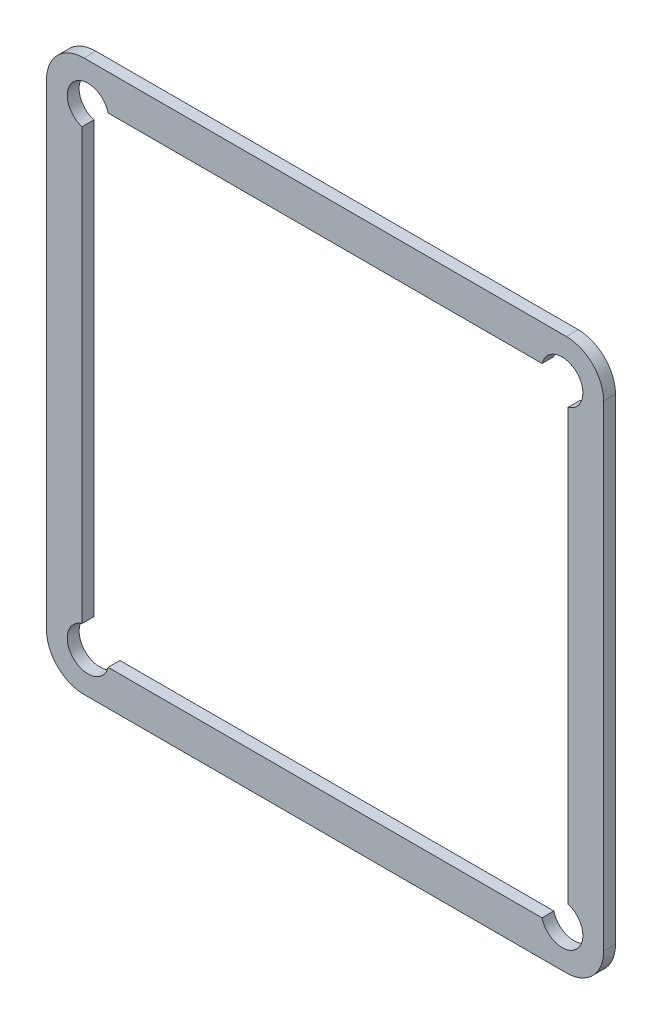
ISO-10303-21;
HEADER;
FILE_DESCRIPTION(('STEP AP214'),'2;1');
FILE_NAME('part.step','',(''),(''),'','','');
FILE_SCHEMA(('AUTOMOTIVE_DESIGN { 1 0 10303 214 1 1 1 1 }'));
ENDSEC;
DATA;
#1=APPLICATION_CONTEXT('core data for automotive mechanical design processes');
#2=APPLICATION_PROTOCOL_DEFINITION('international standard','automotive_design',2000,#1);
#3=PRODUCT_CONTEXT('',#1,'mechanical');
#4=PRODUCT('Part','Part','',(#3));
#5=PRODUCT_RELATED_PRODUCT_CATEGORY('part','',(#4));
#6=PRODUCT_DEFINITION_FORMATION('','',#4);
#7=PRODUCT_DEFINITION_CONTEXT('part definition',#1,'design');
#8=PRODUCT_DEFINITION('design','',#6,#7);
#9=PRODUCT_DEFINITION_SHAPE('','',#8);
#10=(LENGTH_UNIT() NAMED_UNIT(*) SI_UNIT(.MILLI.,.METRE.));
#11=(NAMED_UNIT(*) PLANE_ANGLE_UNIT() SI_UNIT($,.RADIAN.));
#12=(NAMED_UNIT(*) SI_UNIT($,.STERADIAN.) SOLID_ANGLE_UNIT());
#13=UNCERTAINTY_MEASURE_WITH_UNIT(LENGTH_MEASURE(1.E-05),#10,'distance_accuracy_value','');
#14=(GEOMETRIC_REPRESENTATION_CONTEXT(3) GLOBAL_UNCERTAINTY_ASSIGNED_CONTEXT((#13)) GLOBAL_UNIT_ASSIGNED_CONTEXT((#10,
#11,#12)) REPRESENTATION_CONTEXT('',''));
#15=CARTESIAN_POINT('',(0.,0.,0.));
#16=DIRECTION('',(0.,0.,1.));
#17=DIRECTION('',(1.,0.,0.));
#18=AXIS2_PLACEMENT_3D('',#15,#16,#17);
#19=CARTESIAN_POINT('',(94.,-93.,1.99999999999999));
#20=DIRECTION('',(0.,0.,-1.));
#21=DIRECTION('',(-1.,0.,0.));
#22=AXIS2_PLACEMENT_3D('',#19,#20,#21);
#23=PLANE('',#22);
#24=DIRECTION('',(-1.,0.,0.));
#25=VECTOR('',#24,1.);
#26=CARTESIAN_POINT('',(0.,0.,2.));
#27=LINE('',#26,#25);
#28=CARTESIAN_POINT('',(87.7,0.,2.));
#29=VERTEX_POINT('',#28);
#30=CARTESIAN_POINT('',(6.3,0.,2.));
#31=VERTEX_POINT('',#30);
#32=EDGE_CURVE('E222',#29,#31,#27,.T.);
#33=ORIENTED_EDGE('',*,*,#32,.T.);
#34=CARTESIAN_POINT('',(6.3,-6.29999999999997,1.99999999999997));
#35=DIRECTION('',(0.,0.,-1.));
#36=DIRECTION('',(-1.,0.,0.));
#37=AXIS2_PLACEMENT_3D('',#34,#35,#36);
#38=CIRCLE('',#37,6.3);
#39=CARTESIAN_POINT('',(0.,-6.29999999999997,1.99999999999997));
#40=VERTEX_POINT('',#39);
#41=EDGE_CURVE('E260',#31,#40,#38,.F.);
#42=ORIENTED_EDGE('',*,*,#41,.T.);
#43=DIRECTION('',(0.,-1.,0.));
#44=VECTOR('',#43,1.);
#45=CARTESIAN_POINT('',(0.,0.,2.));
#46=LINE('',#45,#44);
#47=CARTESIAN_POINT('',(0.,-86.7,1.99999999999999));
#48=VERTEX_POINT('',#47);
#49=EDGE_CURVE('E225',#40,#48,#46,.T.);
#50=ORIENTED_EDGE('',*,*,#49,.T.);
#51=CARTESIAN_POINT('',(6.3,-86.7,1.99999999999999));
#52=DIRECTION('',(0.,0.,-1.));
#53=DIRECTION('',(-1.,0.,0.));
#54=AXIS2_PLACEMENT_3D('',#51,#52,#53);
#55=CIRCLE('',#54,6.3);
#56=CARTESIAN_POINT('',(6.3,-93.,1.99999999999999));
#57=VERTEX_POINT('',#56);
#58=EDGE_CURVE('E255',#48,#57,#55,.F.);
#59=ORIENTED_EDGE('',*,*,#58,.T.);
#60=DIRECTION('',(1.,0.,0.));
#61=VECTOR('',#60,1.);
#62=CARTESIAN_POINT('',(0.,-93.,1.99999999999999));
#63=LINE('',#62,#61);
#64=CARTESIAN_POINT('',(87.7,-93.,1.99999999999999));
#65=VERTEX_POINT('',#64);
#66=EDGE_CURVE('E217',#57,#65,#63,.T.);
#67=ORIENTED_EDGE('',*,*,#66,.T.);
#68=CARTESIAN_POINT('',(87.7,-86.7,1.99999999999999));
#69=DIRECTION('',(0.,0.,-1.));
#70=DIRECTION('',(-1.,0.,0.));
#71=AXIS2_PLACEMENT_3D('',#68,#69,#70);
#72=CIRCLE('',#71,6.3);
#73=CARTESIAN_POINT('',(94.,-86.7,1.99999999999999));
#74=VERTEX_POINT('',#73);
#75=EDGE_CURVE('E54',#65,#74,#72,.F.);
#76=ORIENTED_EDGE('',*,*,#75,.T.);
#77=DIRECTION('',(0.,1.,0.));
#78=VECTOR('',#77,1.);
#79=CARTESIAN_POINT('',(94.,0.,2.));
#80=LINE('',#79,#78);
#81=CARTESIAN_POINT('',(94.,-6.29999999999997,1.99999999999997));
#82=VERTEX_POINT('',#81);
#83=EDGE_CURVE('E219',#74,#82,#80,.T.);
#84=ORIENTED_EDGE('',*,*,#83,.T.);
#85=CARTESIAN_POINT('',(87.7,-6.29999999999997,1.99999999999997));
#86=DIRECTION('',(0.,0.,-1.));
#87=DIRECTION('',(-1.,0.,0.));
#88=AXIS2_PLACEMENT_3D('',#85,#86,#87);
#89=CIRCLE('',#88,6.3);
#90=EDGE_CURVE('E258',#82,#29,#89,.F.);
#91=ORIENTED_EDGE('',*,*,#90,.T.);
#92=EDGE_LOOP('',(#33,#42,#50,#59,#67,#76,#84,#91));
#93=FACE_BOUND('',#92,.T.);
#94=CARTESIAN_POINT('',(87.,-86.1499999999999,2.));
#95=DIRECTION('',(0.,0.,1.));
#96=DIRECTION('',(-1.,0.,0.));
#97=AXIS2_PLACEMENT_3D('',#94,#95,#96);
#98=CIRCLE('',#97,3.49999999999998);
#99=CARTESIAN_POINT('',(83.604782775727,-87.,2.00000000000002));
#100=VERTEX_POINT('',#99);
#101=CARTESIAN_POINT('',(88.,-82.7958980337503,2.00000000000002));
#102=VERTEX_POINT('',#101);
#103=EDGE_CURVE('E147',#100,#102,#98,.T.);
#104=ORIENTED_EDGE('',*,*,#103,.F.);
#105=DIRECTION('',(1.,0.,0.));
#106=VECTOR('',#105,1.);
#107=CARTESIAN_POINT('',(10.395217224273,-87.,2.00000000000002));
#108=LINE('',#107,#106);
#109=CARTESIAN_POINT('',(10.395217224273,-87.,2.00000000000002));
#110=VERTEX_POINT('',#109);
#111=EDGE_CURVE('E183',#110,#100,#108,.T.);
#112=ORIENTED_EDGE('',*,*,#111,.F.);
#113=CARTESIAN_POINT('',(7.00000000000001,-86.15,2.));
#114=DIRECTION('',(0.,0.,1.));
#115=DIRECTION('',(1.,0.,0.));
#116=AXIS2_PLACEMENT_3D('',#113,#114,#115);
#117=CIRCLE('',#116,3.5);
#118=CARTESIAN_POINT('',(6.00000000000001,-82.7958980337503,2.00000000000002));
#119=VERTEX_POINT('',#118);
#120=EDGE_CURVE('E180',#119,#110,#117,.T.);
#121=ORIENTED_EDGE('',*,*,#120,.F.);
#122=DIRECTION('',(0.,-1.,0.));
#123=VECTOR('',#122,1.);
#124=CARTESIAN_POINT('',(6.00000000000002,-10.2041019662496,1.99999999999999));
#125=LINE('',#124,#123);
#126=CARTESIAN_POINT('',(6.00000000000002,-10.2041019662496,1.99999999999999));
#127=VERTEX_POINT('',#126);
#128=EDGE_CURVE('E178',#127,#119,#125,.T.);
#129=ORIENTED_EDGE('',*,*,#128,.F.);
#130=CARTESIAN_POINT('',(6.99999999999999,-6.85000000000007,2.));
#131=DIRECTION('',(0.,0.,1.));
#132=DIRECTION('',(-1.,0.,0.));
#133=AXIS2_PLACEMENT_3D('',#130,#131,#132);
#134=CIRCLE('',#133,3.49999999999996);
#135=CARTESIAN_POINT('',(10.3952172242729,-5.99999999999999,1.99999999999999));
#136=VERTEX_POINT('',#135);
#137=EDGE_CURVE('E176',#136,#127,#134,.T.);
#138=ORIENTED_EDGE('',*,*,#137,.F.);
#139=DIRECTION('',(-1.,0.,0.));
#140=VECTOR('',#139,1.);
#141=CARTESIAN_POINT('',(10.395217224273,-5.99999999999999,1.99999999999999));
#142=LINE('',#141,#140);
#143=CARTESIAN_POINT('',(83.604782775727,-5.99999999999999,1.99999999999999));
#144=VERTEX_POINT('',#143);
#145=EDGE_CURVE('E172',#144,#136,#142,.T.);
#146=ORIENTED_EDGE('',*,*,#145,.F.);
#147=CARTESIAN_POINT('',(87.,-6.85000000000006,2.));
#148=DIRECTION('',(0.,0.,1.));
#149=DIRECTION('',(1.,0.,0.));
#150=AXIS2_PLACEMENT_3D('',#147,#148,#149);
#151=CIRCLE('',#150,3.49999999999996);
#152=CARTESIAN_POINT('',(88.,-10.2041019662497,2.00000000000002));
#153=VERTEX_POINT('',#152);
#154=EDGE_CURVE('E170',#153,#144,#151,.T.);
#155=ORIENTED_EDGE('',*,*,#154,.F.);
#156=DIRECTION('',(0.,1.,0.));
#157=VECTOR('',#156,1.);
#158=CARTESIAN_POINT('',(88.,-10.2041019662496,1.99999999999999));
#159=LINE('',#158,#157);
#160=EDGE_CURVE('E157',#102,#153,#159,.T.);
#161=ORIENTED_EDGE('',*,*,#160,.F.);
#162=EDGE_LOOP('',(#104,#112,#121,#129,#138,#146,#155,#161));
#163=FACE_BOUND('',#162,.T.);
#164=ADVANCED_FACE('F32',(#93,#163),#23,.F.);
#165=CARTESIAN_POINT('',(94.,-93.,0.));
#166=DIRECTION('',(0.,0.,-1.));
#167=DIRECTION('',(-1.,0.,0.));
#168=AXIS2_PLACEMENT_3D('',#165,#166,#167);
#169=PLANE('',#168);
#170=DIRECTION('',(0.,-1.,0.));
#171=VECTOR('',#170,1.);
#172=CARTESIAN_POINT('',(0.,0.,0.));
#173=LINE('',#172,#171);
#174=CARTESIAN_POINT('',(0.,-6.29999999999997,0.));
#175=VERTEX_POINT('',#174);
#176=CARTESIAN_POINT('',(0.,-86.7,0.));
#177=VERTEX_POINT('',#176);
#178=EDGE_CURVE('E220',#175,#177,#173,.T.);
#179=ORIENTED_EDGE('',*,*,#178,.F.);
#180=CARTESIAN_POINT('',(6.3,-6.29999999999997,0.));
#181=DIRECTION('',(0.,0.,-1.));
#182=DIRECTION('',(-1.,0.,0.));
#183=AXIS2_PLACEMENT_3D('',#180,#181,#182);
#184=CIRCLE('',#183,6.3);
#185=CARTESIAN_POINT('',(6.3,0.,0.));
#186=VERTEX_POINT('',#185);
#187=EDGE_CURVE('E248',#175,#186,#184,.T.);
#188=ORIENTED_EDGE('',*,*,#187,.T.);
#189=DIRECTION('',(-1.,0.,0.));
#190=VECTOR('',#189,1.);
#191=CARTESIAN_POINT('',(0.,0.,0.));
#192=LINE('',#191,#190);
#193=CARTESIAN_POINT('',(87.7,0.,0.));
#194=VERTEX_POINT('',#193);
#195=EDGE_CURVE('E233',#194,#186,#192,.T.);
#196=ORIENTED_EDGE('',*,*,#195,.F.);
#197=CARTESIAN_POINT('',(87.7,-6.29999999999997,0.));
#198=DIRECTION('',(0.,0.,-1.));
#199=DIRECTION('',(-1.,0.,0.));
#200=AXIS2_PLACEMENT_3D('',#197,#198,#199);
#201=CIRCLE('',#200,6.3);
#202=CARTESIAN_POINT('',(94.,-6.29999999999997,0.));
#203=VERTEX_POINT('',#202);
#204=EDGE_CURVE('E246',#194,#203,#201,.T.);
#205=ORIENTED_EDGE('',*,*,#204,.T.);
#206=DIRECTION('',(0.,1.,0.));
#207=VECTOR('',#206,1.);
#208=CARTESIAN_POINT('',(94.,0.,0.));
#209=LINE('',#208,#207);
#210=CARTESIAN_POINT('',(94.,-86.7,0.));
#211=VERTEX_POINT('',#210);
#212=EDGE_CURVE('E231',#211,#203,#209,.T.);
#213=ORIENTED_EDGE('',*,*,#212,.F.);
#214=CARTESIAN_POINT('',(87.7,-86.7,0.));
#215=DIRECTION('',(0.,0.,-1.));
#216=DIRECTION('',(-1.,0.,0.));
#217=AXIS2_PLACEMENT_3D('',#214,#215,#216);
#218=CIRCLE('',#217,6.3);
#219=CARTESIAN_POINT('',(87.7,-93.,0.));
#220=VERTEX_POINT('',#219);
#221=EDGE_CURVE('E244',#211,#220,#218,.T.);
#222=ORIENTED_EDGE('',*,*,#221,.T.);
#223=DIRECTION('',(1.,0.,0.));
#224=VECTOR('',#223,1.);
#225=CARTESIAN_POINT('',(0.,-93.,0.));
#226=LINE('',#225,#224);
#227=CARTESIAN_POINT('',(6.3,-93.,0.));
#228=VERTEX_POINT('',#227);
#229=EDGE_CURVE('E165',#228,#220,#226,.T.);
#230=ORIENTED_EDGE('',*,*,#229,.F.);
#231=CARTESIAN_POINT('',(6.3,-86.7,0.));
#232=DIRECTION('',(0.,0.,-1.));
#233=DIRECTION('',(-1.,0.,0.));
#234=AXIS2_PLACEMENT_3D('',#231,#232,#233);
#235=CIRCLE('',#234,6.3);
#236=EDGE_CURVE('E242',#228,#177,#235,.T.);
#237=ORIENTED_EDGE('',*,*,#236,.T.);
#238=EDGE_LOOP('',(#179,#188,#196,#205,#213,#222,#230,#237));
#239=FACE_BOUND('',#238,.T.);
#240=DIRECTION('',(1.,0.,0.));
#241=VECTOR('',#240,1.);
#242=CARTESIAN_POINT('',(10.395217224273,-87.,0.));
#243=LINE('',#242,#241);
#244=CARTESIAN_POINT('',(10.395217224273,-87.,0.));
#245=VERTEX_POINT('',#244);
#246=CARTESIAN_POINT('',(83.604782775727,-87.,0.));
#247=VERTEX_POINT('',#246);
#248=EDGE_CURVE('E158',#245,#247,#243,.T.);
#249=ORIENTED_EDGE('',*,*,#248,.T.);
#250=CARTESIAN_POINT('',(87.,-86.1499999999999,0.));
#251=DIRECTION('',(0.,0.,1.));
#252=DIRECTION('',(-1.,0.,0.));
#253=AXIS2_PLACEMENT_3D('',#250,#251,#252);
#254=CIRCLE('',#253,3.49999999999998);
#255=CARTESIAN_POINT('',(88.,-82.7958980337503,0.));
#256=VERTEX_POINT('',#255);
#257=EDGE_CURVE('E185',#247,#256,#254,.T.);
#258=ORIENTED_EDGE('',*,*,#257,.T.);
#259=DIRECTION('',(0.,1.,0.));
#260=VECTOR('',#259,1.);
#261=CARTESIAN_POINT('',(88.,-10.2041019662496,0.));
#262=LINE('',#261,#260);
#263=CARTESIAN_POINT('',(88.,-10.2041019662497,0.));
#264=VERTEX_POINT('',#263);
#265=EDGE_CURVE('E164',#256,#264,#262,.T.);
#266=ORIENTED_EDGE('',*,*,#265,.T.);
#267=CARTESIAN_POINT('',(87.,-6.85000000000003,0.));
#268=DIRECTION('',(0.,0.,1.));
#269=DIRECTION('',(1.,0.,0.));
#270=AXIS2_PLACEMENT_3D('',#267,#268,#269);
#271=CIRCLE('',#270,3.49999999999996);
#272=CARTESIAN_POINT('',(83.604782775727,-5.99999999999999,0.));
#273=VERTEX_POINT('',#272);
#274=EDGE_CURVE('E188',#264,#273,#271,.T.);
#275=ORIENTED_EDGE('',*,*,#274,.T.);
#276=DIRECTION('',(-1.,0.,0.));
#277=VECTOR('',#276,1.);
#278=CARTESIAN_POINT('',(10.395217224273,-5.99999999999999,0.));
#279=LINE('',#278,#277);
#280=CARTESIAN_POINT('',(10.3952172242729,-5.99999999999999,0.));
#281=VERTEX_POINT('',#280);
#282=EDGE_CURVE('E191',#273,#281,#279,.T.);
#283=ORIENTED_EDGE('',*,*,#282,.T.);
#284=CARTESIAN_POINT('',(6.99999999999999,-6.85000000000007,0.));
#285=DIRECTION('',(0.,0.,1.));
#286=DIRECTION('',(-1.,0.,0.));
#287=AXIS2_PLACEMENT_3D('',#284,#285,#286);
#288=CIRCLE('',#287,3.49999999999996);
#289=CARTESIAN_POINT('',(6.00000000000002,-10.2041019662496,0.));
#290=VERTEX_POINT('',#289);
#291=EDGE_CURVE('E194',#281,#290,#288,.T.);
#292=ORIENTED_EDGE('',*,*,#291,.T.);
#293=DIRECTION('',(0.,-1.,0.));
#294=VECTOR('',#293,1.);
#295=CARTESIAN_POINT('',(6.00000000000002,-10.2041019662496,0.));
#296=LINE('',#295,#294);
#297=CARTESIAN_POINT('',(6.00000000000001,-82.7958980337503,0.));
#298=VERTEX_POINT('',#297);
#299=EDGE_CURVE('E197',#290,#298,#296,.T.);
#300=ORIENTED_EDGE('',*,*,#299,.T.);
#301=CARTESIAN_POINT('',(7.00000000000001,-86.15,0.));
#302=DIRECTION('',(0.,0.,1.));
#303=DIRECTION('',(1.,0.,0.));
#304=AXIS2_PLACEMENT_3D('',#301,#302,#303);
#305=CIRCLE('',#304,3.5);
#306=EDGE_CURVE('E200',#298,#245,#305,.T.);
#307=ORIENTED_EDGE('',*,*,#306,.T.);
#308=EDGE_LOOP('',(#249,#258,#266,#275,#283,#292,#300,#307));
#309=FACE_BOUND('',#308,.T.);
#310=ADVANCED_FACE('F276',(#239,#309),#169,.T.);
#311=CARTESIAN_POINT('',(0.,-93.,1.99999999999999));
#312=DIRECTION('',(0.,1.,0.));
#313=DIRECTION('',(0.,0.,1.));
#314=AXIS2_PLACEMENT_3D('',#311,#312,#313);
#315=PLANE('',#314);
#316=ORIENTED_EDGE('',*,*,#229,.T.);
#317=DIRECTION('',(0.,0.,-1.));
#318=VECTOR('',#317,1.);
#319=CARTESIAN_POINT('',(87.7,-93.,1.99999999999999));
#320=LINE('',#319,#318);
#321=EDGE_CURVE('E11',#220,#65,#320,.F.);
#322=ORIENTED_EDGE('',*,*,#321,.T.);
#323=ORIENTED_EDGE('',*,*,#66,.F.);
#324=DIRECTION('',(0.,0.,-1.));
#325=VECTOR('',#324,1.);
#326=CARTESIAN_POINT('',(6.3,-93.,1.99999999999999));
#327=LINE('',#326,#325);
#328=EDGE_CURVE('E40',#57,#228,#327,.T.);
#329=ORIENTED_EDGE('',*,*,#328,.T.);
#330=EDGE_LOOP('',(#316,#322,#323,#329));
#331=FACE_BOUND('',#330,.T.);
#332=ADVANCED_FACE('F270',(#331),#315,.F.);
#333=CARTESIAN_POINT('',(94.,0.,2.));
#334=DIRECTION('',(-1.,0.,0.));
#335=DIRECTION('',(0.,0.,1.));
#336=AXIS2_PLACEMENT_3D('',#333,#334,#335);
#337=PLANE('',#336);
#338=ORIENTED_EDGE('',*,*,#212,.T.);
#339=DIRECTION('',(0.,0.,-1.));
#340=VECTOR('',#339,1.);
#341=CARTESIAN_POINT('',(94.,-6.29999999999997,1.99999999999997));
#342=LINE('',#341,#340);
#343=EDGE_CURVE('E47',#203,#82,#342,.F.);
#344=ORIENTED_EDGE('',*,*,#343,.T.);
#345=ORIENTED_EDGE('',*,*,#83,.F.);
#346=DIRECTION('',(0.,0.,-1.));
#347=VECTOR('',#346,1.);
#348=CARTESIAN_POINT('',(94.,-86.7,1.99999999999999));
#349=LINE('',#348,#347);
#350=EDGE_CURVE('E262',#74,#211,#349,.T.);
#351=ORIENTED_EDGE('',*,*,#350,.T.);
#352=EDGE_LOOP('',(#338,#344,#345,#351));
#353=FACE_BOUND('',#352,.T.);
#354=ADVANCED_FACE('F282',(#353),#337,.F.);
#355=CARTESIAN_POINT('',(0.,0.,2.));
#356=DIRECTION('',(0.,-1.,0.));
#357=DIRECTION('',(0.,0.,-1.));
#358=AXIS2_PLACEMENT_3D('',#355,#356,#357);
#359=PLANE('',#358);
#360=ORIENTED_EDGE('',*,*,#195,.T.);
#361=DIRECTION('',(0.,0.,-1.));
#362=VECTOR('',#361,1.);
#363=CARTESIAN_POINT('',(6.3,0.,2.));
#364=LINE('',#363,#362);
#365=EDGE_CURVE('E253',#186,#31,#364,.F.);
#366=ORIENTED_EDGE('',*,*,#365,.T.);
#367=ORIENTED_EDGE('',*,*,#32,.F.);
#368=DIRECTION('',(0.,0.,-1.));
#369=VECTOR('',#368,1.);
#370=CARTESIAN_POINT('',(87.7,0.,2.));
#371=LINE('',#370,#369);
#372=EDGE_CURVE('E250',#29,#194,#371,.T.);
#373=ORIENTED_EDGE('',*,*,#372,.T.);
#374=EDGE_LOOP('',(#360,#366,#367,#373));
#375=FACE_BOUND('',#374,.T.);
#376=ADVANCED_FACE('F290',(#375),#359,.F.);
#377=CARTESIAN_POINT('',(0.,0.,2.));
#378=DIRECTION('',(1.,0.,0.));
#379=DIRECTION('',(0.,0.,-1.));
#380=AXIS2_PLACEMENT_3D('',#377,#378,#379);
#381=PLANE('',#380);
#382=ORIENTED_EDGE('',*,*,#49,.F.);
#383=DIRECTION('',(0.,0.,-1.));
#384=VECTOR('',#383,1.);
#385=CARTESIAN_POINT('',(0.,-6.29999999999997,1.99999999999997));
#386=LINE('',#385,#384);
#387=EDGE_CURVE('E239',#40,#175,#386,.T.);
#388=ORIENTED_EDGE('',*,*,#387,.T.);
#389=ORIENTED_EDGE('',*,*,#178,.T.);
#390=DIRECTION('',(0.,0.,-1.));
#391=VECTOR('',#390,1.);
#392=CARTESIAN_POINT('',(0.,-86.7,1.99999999999999));
#393=LINE('',#392,#391);
#394=EDGE_CURVE('E228',#177,#48,#393,.F.);
#395=ORIENTED_EDGE('',*,*,#394,.T.);
#396=EDGE_LOOP('',(#382,#388,#389,#395));
#397=FACE_BOUND('',#396,.T.);
#398=ADVANCED_FACE('F298',(#397),#381,.F.);
#399=CARTESIAN_POINT('',(87.,-86.1499999999999,2.));
#400=DIRECTION('',(0.,0.,-1.));
#401=DIRECTION('',(-1.,0.,0.));
#402=AXIS2_PLACEMENT_3D('',#399,#400,#401);
#403=CYLINDRICAL_SURFACE('',#402,3.49999999999998);
#404=ORIENTED_EDGE('',*,*,#257,.F.);
#405=DIRECTION('',(0.,0.,-1.));
#406=VECTOR('',#405,1.);
#407=CARTESIAN_POINT('',(83.604782775727,-87.,2.00000000000002));
#408=LINE('',#407,#406);
#409=EDGE_CURVE('E153',#100,#247,#408,.T.);
#410=ORIENTED_EDGE('',*,*,#409,.F.);
#411=ORIENTED_EDGE('',*,*,#103,.T.);
#412=DIRECTION('',(0.,0.,-1.));
#413=VECTOR('',#412,1.);
#414=CARTESIAN_POINT('',(88.,-82.7958980337503,2.00000000000002));
#415=LINE('',#414,#413);
#416=EDGE_CURVE('E150',#102,#256,#415,.T.);
#417=ORIENTED_EDGE('',*,*,#416,.T.);
#418=EDGE_LOOP('',(#404,#410,#411,#417));
#419=FACE_BOUND('',#418,.T.);
#420=ADVANCED_FACE('F149',(#419),#403,.F.);
#421=CARTESIAN_POINT('',(88.,-10.2041019662496,1.99999999999999));
#422=DIRECTION('',(-1.,0.,0.));
#423=DIRECTION('',(0.,0.,1.));
#424=AXIS2_PLACEMENT_3D('',#421,#422,#423);
#425=PLANE('',#424);
#426=ORIENTED_EDGE('',*,*,#265,.F.);
#427=ORIENTED_EDGE('',*,*,#416,.F.);
#428=ORIENTED_EDGE('',*,*,#160,.T.);
#429=DIRECTION('',(0.,0.,-1.));
#430=VECTOR('',#429,1.);
#431=CARTESIAN_POINT('',(88.,-10.2041019662497,2.00000000000002));
#432=LINE('',#431,#430);
#433=EDGE_CURVE('E166',#153,#264,#432,.T.);
#434=ORIENTED_EDGE('',*,*,#433,.T.);
#435=EDGE_LOOP('',(#426,#427,#428,#434));
#436=FACE_BOUND('',#435,.T.);
#437=ADVANCED_FACE('F161',(#436),#425,.T.);
#438=CARTESIAN_POINT('',(87.,-6.85000000000006,2.));
#439=DIRECTION('',(0.,0.,-1.));
#440=DIRECTION('',(-1.,0.,0.));
#441=AXIS2_PLACEMENT_3D('',#438,#439,#440);
#442=CYLINDRICAL_SURFACE('',#441,3.49999999999996);
#443=ORIENTED_EDGE('',*,*,#274,.F.);
#444=ORIENTED_EDGE('',*,*,#433,.F.);
#445=ORIENTED_EDGE('',*,*,#154,.T.);
#446=DIRECTION('',(0.,0.,-1.));
#447=VECTOR('',#446,1.);
#448=CARTESIAN_POINT('',(83.604782775727,-5.99999999999999,1.99999999999999));
#449=LINE('',#448,#447);
#450=EDGE_CURVE('E214',#144,#273,#449,.T.);
#451=ORIENTED_EDGE('',*,*,#450,.T.);
#452=EDGE_LOOP('',(#443,#444,#445,#451));
#453=FACE_BOUND('',#452,.T.);
#454=ADVANCED_FACE('F389',(#453),#442,.F.);
#455=CARTESIAN_POINT('',(10.395217224273,-5.99999999999999,1.99999999999999));
#456=DIRECTION('',(0.,-1.,0.));
#457=DIRECTION('',(0.,0.,-1.));
#458=AXIS2_PLACEMENT_3D('',#455,#456,#457);
#459=PLANE('',#458);
#460=ORIENTED_EDGE('',*,*,#282,.F.);
#461=ORIENTED_EDGE('',*,*,#450,.F.);
#462=ORIENTED_EDGE('',*,*,#145,.T.);
#463=DIRECTION('',(0.,0.,-1.));
#464=VECTOR('',#463,1.);
#465=CARTESIAN_POINT('',(10.3952172242729,-5.99999999999999,1.99999999999999));
#466=LINE('',#465,#464);
#467=EDGE_CURVE('E212',#136,#281,#466,.T.);
#468=ORIENTED_EDGE('',*,*,#467,.T.);
#469=EDGE_LOOP('',(#460,#461,#462,#468));
#470=FACE_BOUND('',#469,.T.);
#471=ADVANCED_FACE('F380',(#470),#459,.T.);
#472=CARTESIAN_POINT('',(6.99999999999999,-6.85000000000007,2.));
#473=DIRECTION('',(0.,0.,-1.));
#474=DIRECTION('',(-1.,0.,0.));
#475=AXIS2_PLACEMENT_3D('',#472,#473,#474);
#476=CYLINDRICAL_SURFACE('',#475,3.49999999999996);
#477=ORIENTED_EDGE('',*,*,#291,.F.);
#478=ORIENTED_EDGE('',*,*,#467,.F.);
#479=ORIENTED_EDGE('',*,*,#137,.T.);
#480=DIRECTION('',(0.,0.,-1.));
#481=VECTOR('',#480,1.);
#482=CARTESIAN_POINT('',(6.00000000000002,-10.2041019662496,1.99999999999999));
#483=LINE('',#482,#481);
#484=EDGE_CURVE('E210',#127,#290,#483,.T.);
#485=ORIENTED_EDGE('',*,*,#484,.T.);
#486=EDGE_LOOP('',(#477,#478,#479,#485));
#487=FACE_BOUND('',#486,.T.);
#488=ADVANCED_FACE('F371',(#487),#476,.F.);
#489=CARTESIAN_POINT('',(6.00000000000002,-10.2041019662496,1.99999999999999));
#490=DIRECTION('',(1.,0.,0.));
#491=DIRECTION('',(0.,1.,0.));
#492=AXIS2_PLACEMENT_3D('',#489,#490,#491);
#493=PLANE('',#492);
#494=ORIENTED_EDGE('',*,*,#299,.F.);
#495=ORIENTED_EDGE('',*,*,#484,.F.);
#496=ORIENTED_EDGE('',*,*,#128,.T.);
#497=DIRECTION('',(0.,0.,-1.));
#498=VECTOR('',#497,1.);
#499=CARTESIAN_POINT('',(6.00000000000001,-82.7958980337503,2.00000000000002));
#500=LINE('',#499,#498);
#501=EDGE_CURVE('E208',#119,#298,#500,.T.);
#502=ORIENTED_EDGE('',*,*,#501,.T.);
#503=EDGE_LOOP('',(#494,#495,#496,#502));
#504=FACE_BOUND('',#503,.T.);
#505=ADVANCED_FACE('F362',(#504),#493,.T.);
#506=CARTESIAN_POINT('',(7.00000000000001,-86.15,2.));
#507=DIRECTION('',(0.,0.,-1.));
#508=DIRECTION('',(-1.,0.,0.));
#509=AXIS2_PLACEMENT_3D('',#506,#507,#508);
#510=CYLINDRICAL_SURFACE('',#509,3.5);
#511=ORIENTED_EDGE('',*,*,#306,.F.);
#512=ORIENTED_EDGE('',*,*,#501,.F.);
#513=ORIENTED_EDGE('',*,*,#120,.T.);
#514=DIRECTION('',(0.,0.,-1.));
#515=VECTOR('',#514,1.);
#516=CARTESIAN_POINT('',(10.395217224273,-87.,2.00000000000002));
#517=LINE('',#516,#515);
#518=EDGE_CURVE('E206',#110,#245,#517,.T.);
#519=ORIENTED_EDGE('',*,*,#518,.T.);
#520=EDGE_LOOP('',(#511,#512,#513,#519));
#521=FACE_BOUND('',#520,.T.);
#522=ADVANCED_FACE('F353',(#521),#510,.F.);
#523=CARTESIAN_POINT('',(10.395217224273,-87.,2.00000000000002));
#524=DIRECTION('',(0.,1.,0.));
#525=DIRECTION('',(0.,0.,1.));
#526=AXIS2_PLACEMENT_3D('',#523,#524,#525);
#527=PLANE('',#526);
#528=ORIENTED_EDGE('',*,*,#248,.F.);
#529=ORIENTED_EDGE('',*,*,#518,.F.);
#530=ORIENTED_EDGE('',*,*,#111,.T.);
#531=ORIENTED_EDGE('',*,*,#409,.T.);
#532=EDGE_LOOP('',(#528,#529,#530,#531));
#533=FACE_BOUND('',#532,.T.);
#534=ADVANCED_FACE('F323',(#533),#527,.T.);
#535=CARTESIAN_POINT('',(6.3,-6.29999999999997,1.99999999999997));
#536=DIRECTION('',(0.,0.,-1.));
#537=DIRECTION('',(-1.,0.,0.));
#538=AXIS2_PLACEMENT_3D('',#535,#536,#537);
#539=CYLINDRICAL_SURFACE('',#538,6.3);
#540=ORIENTED_EDGE('',*,*,#41,.F.);
#541=ORIENTED_EDGE('',*,*,#365,.F.);
#542=ORIENTED_EDGE('',*,*,#187,.F.);
#543=ORIENTED_EDGE('',*,*,#387,.F.);
#544=EDGE_LOOP('',(#540,#541,#542,#543));
#545=FACE_BOUND('',#544,.T.);
#546=ADVANCED_FACE('F295',(#545),#539,.T.);
#547=CARTESIAN_POINT('',(87.7,-6.29999999999997,1.99999999999997));
#548=DIRECTION('',(0.,0.,-1.));
#549=DIRECTION('',(-1.,0.,0.));
#550=AXIS2_PLACEMENT_3D('',#547,#548,#549);
#551=CYLINDRICAL_SURFACE('',#550,6.3);
#552=ORIENTED_EDGE('',*,*,#90,.F.);
#553=ORIENTED_EDGE('',*,*,#343,.F.);
#554=ORIENTED_EDGE('',*,*,#204,.F.);
#555=ORIENTED_EDGE('',*,*,#372,.F.);
#556=EDGE_LOOP('',(#552,#553,#554,#555));
#557=FACE_BOUND('',#556,.T.);
#558=ADVANCED_FACE('F287',(#557),#551,.T.);
#559=CARTESIAN_POINT('',(87.7,-86.7,1.99999999999999));
#560=DIRECTION('',(0.,0.,-1.));
#561=DIRECTION('',(-1.,0.,0.));
#562=AXIS2_PLACEMENT_3D('',#559,#560,#561);
#563=CYLINDRICAL_SURFACE('',#562,6.3);
#564=ORIENTED_EDGE('',*,*,#75,.F.);
#565=ORIENTED_EDGE('',*,*,#321,.F.);
#566=ORIENTED_EDGE('',*,*,#221,.F.);
#567=ORIENTED_EDGE('',*,*,#350,.F.);
#568=EDGE_LOOP('',(#564,#565,#566,#567));
#569=FACE_BOUND('',#568,.T.);
#570=ADVANCED_FACE('F281',(#569),#563,.T.);
#571=CARTESIAN_POINT('',(6.3,-86.7,1.99999999999999));
#572=DIRECTION('',(0.,0.,-1.));
#573=DIRECTION('',(-1.,0.,0.));
#574=AXIS2_PLACEMENT_3D('',#571,#572,#573);
#575=CYLINDRICAL_SURFACE('',#574,6.3);
#576=ORIENTED_EDGE('',*,*,#58,.F.);
#577=ORIENTED_EDGE('',*,*,#394,.F.);
#578=ORIENTED_EDGE('',*,*,#236,.F.);
#579=ORIENTED_EDGE('',*,*,#328,.F.);
#580=EDGE_LOOP('',(#576,#577,#578,#579));
#581=FACE_BOUND('',#580,.T.);
#582=ADVANCED_FACE('F34',(#581),#575,.T.);
#583=CLOSED_SHELL('',(#164,#310,#332,#354,#376,#398,#420,#437,#454,#471,#488,#505,#522,#534,
#546,#558,#570,#582));
#584=MANIFOLD_SOLID_BREP('B2',#583);
#585=ADVANCED_BREP_SHAPE_REPRESENTATION('',(#18,#584),#14);
#586=SHAPE_DEFINITION_REPRESENTATION(#9,#585);
ENDSEC;
END-ISO-10303-21;
